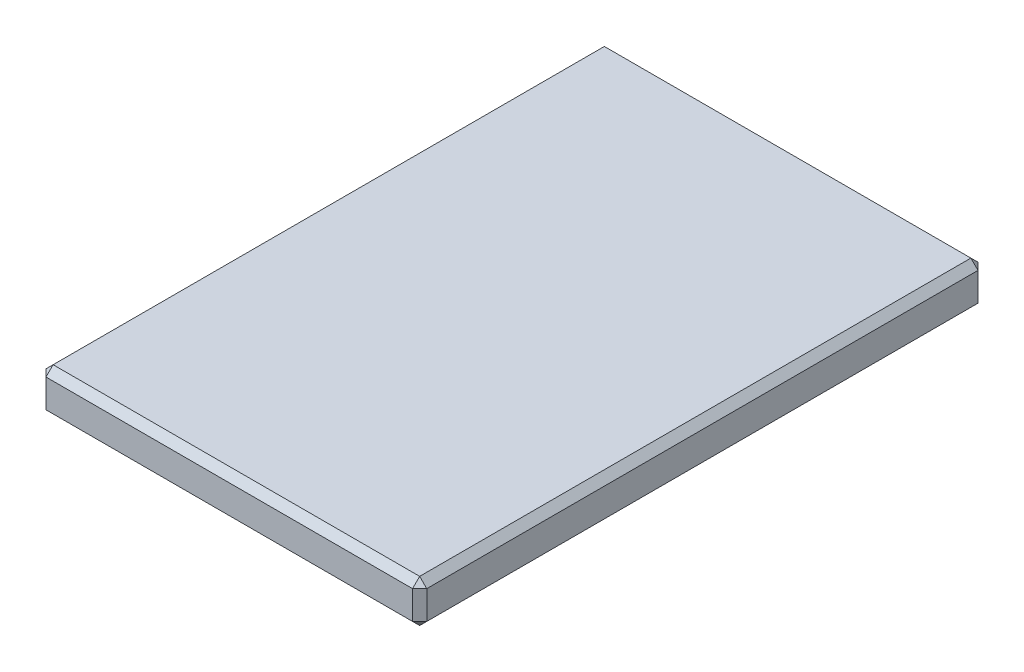
ISO-10303-21;
HEADER;
FILE_DESCRIPTION(('STEP AP214'),'2;1');
FILE_NAME('part.step','',(''),(''),'','','');
FILE_SCHEMA(('AUTOMOTIVE_DESIGN { 1 0 10303 214 1 1 1 1 }'));
ENDSEC;
DATA;
#1=APPLICATION_CONTEXT('core data for automotive mechanical design processes');
#2=APPLICATION_PROTOCOL_DEFINITION('international standard','automotive_design',2000,#1);
#3=PRODUCT_CONTEXT('',#1,'mechanical');
#4=PRODUCT('Part','Part','',(#3));
#5=PRODUCT_RELATED_PRODUCT_CATEGORY('part','',(#4));
#6=PRODUCT_DEFINITION_FORMATION('','',#4);
#7=PRODUCT_DEFINITION_CONTEXT('part definition',#1,'design');
#8=PRODUCT_DEFINITION('design','',#6,#7);
#9=PRODUCT_DEFINITION_SHAPE('','',#8);
#10=(LENGTH_UNIT() NAMED_UNIT(*) SI_UNIT(.MILLI.,.METRE.));
#11=(NAMED_UNIT(*) PLANE_ANGLE_UNIT() SI_UNIT($,.RADIAN.));
#12=(NAMED_UNIT(*) SI_UNIT($,.STERADIAN.) SOLID_ANGLE_UNIT());
#13=UNCERTAINTY_MEASURE_WITH_UNIT(LENGTH_MEASURE(1.E-05),#10,'distance_accuracy_value','');
#14=(GEOMETRIC_REPRESENTATION_CONTEXT(3) GLOBAL_UNCERTAINTY_ASSIGNED_CONTEXT((#13)) GLOBAL_UNIT_ASSIGNED_CONTEXT((#10,
#11,#12)) REPRESENTATION_CONTEXT('',''));
#15=CARTESIAN_POINT('',(0.,0.,0.));
#16=DIRECTION('',(0.,0.,1.));
#17=DIRECTION('',(1.,0.,0.));
#18=AXIS2_PLACEMENT_3D('',#15,#16,#17);
#19=CARTESIAN_POINT('',(0.,3.,0.));
#20=DIRECTION('',(1.,0.,0.));
#21=DIRECTION('',(0.,0.,-1.));
#22=AXIS2_PLACEMENT_3D('',#19,#20,#21);
#23=PLANE('',#22);
#24=DIRECTION('',(0.,-1.,0.));
#25=VECTOR('',#24,1.);
#26=CARTESIAN_POINT('',(0.,3.,0.500000000000007));
#27=LINE('',#26,#25);
#28=CARTESIAN_POINT('',(0.,2.49999999999999,0.500000000000007));
#29=VERTEX_POINT('',#28);
#30=CARTESIAN_POINT('',(0.,0.500000000000007,0.500000000000007));
#31=VERTEX_POINT('',#30);
#32=EDGE_CURVE('E132',#29,#31,#27,.T.);
#33=ORIENTED_EDGE('',*,*,#32,.T.);
#34=DIRECTION('',(0.,0.,1.));
#35=VECTOR('',#34,1.);
#36=CARTESIAN_POINT('',(0.,0.500000000000007,0.));
#37=LINE('',#36,#35);
#38=CARTESIAN_POINT('',(0.,0.500000000000007,39.3));
#39=VERTEX_POINT('',#38);
#40=EDGE_CURVE('E128',#31,#39,#37,.T.);
#41=ORIENTED_EDGE('',*,*,#40,.T.);
#42=DIRECTION('',(0.,1.,0.));
#43=VECTOR('',#42,1.);
#44=CARTESIAN_POINT('',(0.,3.,39.3));
#45=LINE('',#44,#43);
#46=CARTESIAN_POINT('',(0.,2.49999999999999,39.3));
#47=VERTEX_POINT('',#46);
#48=EDGE_CURVE('E121',#39,#47,#45,.T.);
#49=ORIENTED_EDGE('',*,*,#48,.T.);
#50=DIRECTION('',(0.,0.,-1.));
#51=VECTOR('',#50,1.);
#52=CARTESIAN_POINT('',(0.,2.49999999999999,0.));
#53=LINE('',#52,#51);
#54=EDGE_CURVE('E125',#47,#29,#53,.T.);
#55=ORIENTED_EDGE('',*,*,#54,.T.);
#56=EDGE_LOOP('',(#33,#41,#49,#55));
#57=FACE_BOUND('',#56,.T.);
#58=ADVANCED_FACE('F33',(#57),#23,.F.);
#59=CARTESIAN_POINT('',(0.,3.,39.8));
#60=DIRECTION('',(0.,0.,-1.));
#61=DIRECTION('',(-1.,0.,0.));
#62=AXIS2_PLACEMENT_3D('',#59,#60,#61);
#63=PLANE('',#62);
#64=DIRECTION('',(-1.,0.,0.));
#65=VECTOR('',#64,1.);
#66=CARTESIAN_POINT('',(0.,2.49999999999999,39.8));
#67=LINE('',#66,#65);
#68=CARTESIAN_POINT('',(26.3,2.49999999999999,39.8));
#69=VERTEX_POINT('',#68);
#70=CARTESIAN_POINT('',(0.500000000000012,2.49999999999999,39.8));
#71=VERTEX_POINT('',#70);
#72=EDGE_CURVE('E182',#69,#71,#67,.T.);
#73=ORIENTED_EDGE('',*,*,#72,.T.);
#74=DIRECTION('',(0.,-1.,0.));
#75=VECTOR('',#74,1.);
#76=CARTESIAN_POINT('',(0.500000000000012,3.,39.8));
#77=LINE('',#76,#75);
#78=CARTESIAN_POINT('',(0.500000000000012,0.500000000000007,39.8));
#79=VERTEX_POINT('',#78);
#80=EDGE_CURVE('E140',#71,#79,#77,.T.);
#81=ORIENTED_EDGE('',*,*,#80,.T.);
#82=DIRECTION('',(1.,0.,0.));
#83=VECTOR('',#82,1.);
#84=CARTESIAN_POINT('',(0.,0.500000000000007,39.8));
#85=LINE('',#84,#83);
#86=CARTESIAN_POINT('',(26.3,0.500000000000007,39.8));
#87=VERTEX_POINT('',#86);
#88=EDGE_CURVE('E186',#79,#87,#85,.T.);
#89=ORIENTED_EDGE('',*,*,#88,.T.);
#90=DIRECTION('',(0.,1.,0.));
#91=VECTOR('',#90,1.);
#92=CARTESIAN_POINT('',(26.3,3.,39.8));
#93=LINE('',#92,#91);
#94=EDGE_CURVE('E184',#87,#69,#93,.T.);
#95=ORIENTED_EDGE('',*,*,#94,.T.);
#96=EDGE_LOOP('',(#73,#81,#89,#95));
#97=FACE_BOUND('',#96,.T.);
#98=ADVANCED_FACE('F293',(#97),#63,.F.);
#99=CARTESIAN_POINT('',(26.8,3.,0.));
#100=DIRECTION('',(-1.,0.,0.));
#101=DIRECTION('',(0.,0.,1.));
#102=AXIS2_PLACEMENT_3D('',#99,#100,#101);
#103=PLANE('',#102);
#104=DIRECTION('',(0.,0.,-1.));
#105=VECTOR('',#104,1.);
#106=CARTESIAN_POINT('',(26.8,0.500000000000007,0.));
#107=LINE('',#106,#105);
#108=CARTESIAN_POINT('',(26.8,0.500000000000007,39.3));
#109=VERTEX_POINT('',#108);
#110=CARTESIAN_POINT('',(26.8,0.500000000000007,0.500000000000007));
#111=VERTEX_POINT('',#110);
#112=EDGE_CURVE('E177',#109,#111,#107,.T.);
#113=ORIENTED_EDGE('',*,*,#112,.T.);
#114=DIRECTION('',(0.,1.,0.));
#115=VECTOR('',#114,1.);
#116=CARTESIAN_POINT('',(26.8,3.,0.500000000000007));
#117=LINE('',#116,#115);
#118=CARTESIAN_POINT('',(26.8,2.49999999999999,0.500000000000007));
#119=VERTEX_POINT('',#118);
#120=EDGE_CURVE('E179',#111,#119,#117,.T.);
#121=ORIENTED_EDGE('',*,*,#120,.T.);
#122=DIRECTION('',(0.,0.,1.));
#123=VECTOR('',#122,1.);
#124=CARTESIAN_POINT('',(26.8,2.49999999999999,39.8));
#125=LINE('',#124,#123);
#126=CARTESIAN_POINT('',(26.8,2.49999999999999,39.3));
#127=VERTEX_POINT('',#126);
#128=EDGE_CURVE('E173',#119,#127,#125,.T.);
#129=ORIENTED_EDGE('',*,*,#128,.T.);
#130=DIRECTION('',(0.,-1.,0.));
#131=VECTOR('',#130,1.);
#132=CARTESIAN_POINT('',(26.8,3.,39.3));
#133=LINE('',#132,#131);
#134=EDGE_CURVE('E175',#127,#109,#133,.T.);
#135=ORIENTED_EDGE('',*,*,#134,.T.);
#136=EDGE_LOOP('',(#113,#121,#129,#135));
#137=FACE_BOUND('',#136,.T.);
#138=ADVANCED_FACE('F272',(#137),#103,.F.);
#139=CARTESIAN_POINT('',(0.,3.,0.));
#140=DIRECTION('',(0.,0.,1.));
#141=DIRECTION('',(1.,0.,0.));
#142=AXIS2_PLACEMENT_3D('',#139,#140,#141);
#143=PLANE('',#142);
#144=DIRECTION('',(0.,-1.,0.));
#145=VECTOR('',#144,1.);
#146=CARTESIAN_POINT('',(26.3,3.,0.));
#147=LINE('',#146,#145);
#148=CARTESIAN_POINT('',(26.3,2.49999999999999,0.));
#149=VERTEX_POINT('',#148);
#150=CARTESIAN_POINT('',(26.3,0.500000000000007,0.));
#151=VERTEX_POINT('',#150);
#152=EDGE_CURVE('E166',#149,#151,#147,.T.);
#153=ORIENTED_EDGE('',*,*,#152,.T.);
#154=DIRECTION('',(-1.,0.,0.));
#155=VECTOR('',#154,1.);
#156=CARTESIAN_POINT('',(0.,0.500000000000007,0.));
#157=LINE('',#156,#155);
#158=CARTESIAN_POINT('',(0.500000000000007,0.500000000000007,0.));
#159=VERTEX_POINT('',#158);
#160=EDGE_CURVE('E171',#151,#159,#157,.T.);
#161=ORIENTED_EDGE('',*,*,#160,.T.);
#162=DIRECTION('',(0.,1.,0.));
#163=VECTOR('',#162,1.);
#164=CARTESIAN_POINT('',(0.500000000000007,3.,0.));
#165=LINE('',#164,#163);
#166=CARTESIAN_POINT('',(0.500000000000007,2.49999999999999,0.));
#167=VERTEX_POINT('',#166);
#168=EDGE_CURVE('E168',#159,#167,#165,.T.);
#169=ORIENTED_EDGE('',*,*,#168,.T.);
#170=DIRECTION('',(1.,0.,0.));
#171=VECTOR('',#170,1.);
#172=CARTESIAN_POINT('',(26.8,2.49999999999999,0.));
#173=LINE('',#172,#171);
#174=EDGE_CURVE('E164',#167,#149,#173,.T.);
#175=ORIENTED_EDGE('',*,*,#174,.T.);
#176=EDGE_LOOP('',(#153,#161,#169,#175));
#177=FACE_BOUND('',#176,.T.);
#178=ADVANCED_FACE('F300',(#177),#143,.F.);
#179=CARTESIAN_POINT('',(0.,3.,0.));
#180=DIRECTION('',(0.,1.,0.));
#181=DIRECTION('',(0.,0.,1.));
#182=AXIS2_PLACEMENT_3D('',#179,#180,#181);
#183=PLANE('',#182);
#184=DIRECTION('',(0.,0.,-1.));
#185=VECTOR('',#184,1.);
#186=CARTESIAN_POINT('',(26.3,3.,0.));
#187=LINE('',#186,#185);
#188=CARTESIAN_POINT('',(26.3,3.,39.3));
#189=VERTEX_POINT('',#188);
#190=CARTESIAN_POINT('',(26.3,3.,0.500000000000007));
#191=VERTEX_POINT('',#190);
#192=EDGE_CURVE('E42',#189,#191,#187,.T.);
#193=ORIENTED_EDGE('',*,*,#192,.T.);
#194=DIRECTION('',(-1.,0.,0.));
#195=VECTOR('',#194,1.);
#196=CARTESIAN_POINT('',(0.,3.,0.500000000000007));
#197=LINE('',#196,#195);
#198=CARTESIAN_POINT('',(0.500000000000007,3.,0.500000000000007));
#199=VERTEX_POINT('',#198);
#200=EDGE_CURVE('E11',#191,#199,#197,.T.);
#201=ORIENTED_EDGE('',*,*,#200,.T.);
#202=DIRECTION('',(0.,0.,1.));
#203=VECTOR('',#202,1.);
#204=CARTESIAN_POINT('',(0.500000000000012,3.,39.8));
#205=LINE('',#204,#203);
#206=CARTESIAN_POINT('',(0.500000000000012,3.,39.3));
#207=VERTEX_POINT('',#206);
#208=EDGE_CURVE('E198',#199,#207,#205,.T.);
#209=ORIENTED_EDGE('',*,*,#208,.T.);
#210=DIRECTION('',(1.,0.,0.));
#211=VECTOR('',#210,1.);
#212=CARTESIAN_POINT('',(26.8,3.,39.3));
#213=LINE('',#212,#211);
#214=EDGE_CURVE('E53',#207,#189,#213,.T.);
#215=ORIENTED_EDGE('',*,*,#214,.T.);
#216=EDGE_LOOP('',(#193,#201,#209,#215));
#217=FACE_BOUND('',#216,.T.);
#218=ADVANCED_FACE('F364',(#217),#183,.T.);
#219=CARTESIAN_POINT('',(0.,0.,0.));
#220=DIRECTION('',(0.,1.,0.));
#221=DIRECTION('',(0.,0.,1.));
#222=AXIS2_PLACEMENT_3D('',#219,#220,#221);
#223=PLANE('',#222);
#224=DIRECTION('',(0.,0.,1.));
#225=VECTOR('',#224,1.);
#226=CARTESIAN_POINT('',(26.3,0.,0.));
#227=LINE('',#226,#225);
#228=CARTESIAN_POINT('',(26.3,0.,0.500000000000007));
#229=VERTEX_POINT('',#228);
#230=CARTESIAN_POINT('',(26.3,0.,39.3));
#231=VERTEX_POINT('',#230);
#232=EDGE_CURVE('E189',#229,#231,#227,.T.);
#233=ORIENTED_EDGE('',*,*,#232,.T.);
#234=DIRECTION('',(-1.,0.,0.));
#235=VECTOR('',#234,1.);
#236=CARTESIAN_POINT('',(0.,0.,39.3));
#237=LINE('',#236,#235);
#238=CARTESIAN_POINT('',(0.500000000000012,0.,39.3));
#239=VERTEX_POINT('',#238);
#240=EDGE_CURVE('E195',#231,#239,#237,.T.);
#241=ORIENTED_EDGE('',*,*,#240,.T.);
#242=DIRECTION('',(0.,0.,-1.));
#243=VECTOR('',#242,1.);
#244=CARTESIAN_POINT('',(0.500000000000007,0.,0.));
#245=LINE('',#244,#243);
#246=CARTESIAN_POINT('',(0.500000000000007,0.,0.500000000000007));
#247=VERTEX_POINT('',#246);
#248=EDGE_CURVE('E193',#239,#247,#245,.T.);
#249=ORIENTED_EDGE('',*,*,#248,.T.);
#250=DIRECTION('',(1.,0.,0.));
#251=VECTOR('',#250,1.);
#252=CARTESIAN_POINT('',(0.,0.,0.500000000000007));
#253=LINE('',#252,#251);
#254=EDGE_CURVE('E191',#247,#229,#253,.T.);
#255=ORIENTED_EDGE('',*,*,#254,.T.);
#256=EDGE_LOOP('',(#233,#241,#249,#255));
#257=FACE_BOUND('',#256,.T.);
#258=ADVANCED_FACE('F264',(#257),#223,.F.);
#259=CARTESIAN_POINT('',(26.8,3.,39.3));
#260=DIRECTION('',(-0.707106781186547,0.,-0.707106781186547));
#261=DIRECTION('',(0.,-1.,0.));
#262=AXIS2_PLACEMENT_3D('',#259,#260,#261);
#263=PLANE('',#262);
#264=DIRECTION('',(-0.707106781186548,0.,0.707106781186548));
#265=VECTOR('',#264,1.);
#266=CARTESIAN_POINT('',(26.3,2.49999999999999,39.8));
#267=LINE('',#266,#265);
#268=EDGE_CURVE('E37',#69,#127,#267,.F.);
#269=ORIENTED_EDGE('',*,*,#268,.F.);
#270=ORIENTED_EDGE('',*,*,#94,.F.);
#271=DIRECTION('',(0.707106781186548,0.,-0.707106781186548));
#272=VECTOR('',#271,1.);
#273=CARTESIAN_POINT('',(26.3,0.500000000000007,39.8));
#274=LINE('',#273,#272);
#275=EDGE_CURVE('E160',#109,#87,#274,.F.);
#276=ORIENTED_EDGE('',*,*,#275,.F.);
#277=ORIENTED_EDGE('',*,*,#134,.F.);
#278=EDGE_LOOP('',(#269,#270,#276,#277));
#279=FACE_BOUND('',#278,.T.);
#280=ADVANCED_FACE('F35',(#279),#263,.F.);
#281=CARTESIAN_POINT('',(26.3,2.49999999999999,39.8));
#282=DIRECTION('',(0.577350269189625,0.577350269189629,0.577350269189625));
#283=DIRECTION('',(0.,-0.707106781186545,0.70710678118655));
#284=AXIS2_PLACEMENT_3D('',#281,#282,#283);
#285=PLANE('',#284);
#286=DIRECTION('',(0.,-0.707106781186548,0.707106781186548));
#287=VECTOR('',#286,1.);
#288=CARTESIAN_POINT('',(26.3,2.49999999999999,39.8));
#289=LINE('',#288,#287);
#290=EDGE_CURVE('E244',#69,#189,#289,.F.);
#291=ORIENTED_EDGE('',*,*,#290,.F.);
#292=ORIENTED_EDGE('',*,*,#268,.T.);
#293=DIRECTION('',(-0.70710678118655,0.707106781186545,0.));
#294=VECTOR('',#293,1.);
#295=CARTESIAN_POINT('',(26.55,2.75,39.3));
#296=LINE('',#295,#294);
#297=EDGE_CURVE('E246',#189,#127,#296,.F.);
#298=ORIENTED_EDGE('',*,*,#297,.F.);
#299=EDGE_LOOP('',(#291,#292,#298));
#300=FACE_BOUND('',#299,.T.);
#301=ADVANCED_FACE('F288',(#300),#285,.T.);
#302=CARTESIAN_POINT('',(26.3,0.500000000000007,39.8));
#303=DIRECTION('',(0.577350269189625,-0.577350269189629,0.577350269189625));
#304=DIRECTION('',(0.,-0.707106781186545,-0.70710678118655));
#305=AXIS2_PLACEMENT_3D('',#302,#303,#304);
#306=PLANE('',#305);
#307=DIRECTION('',(-0.70710678118655,-0.707106781186545,0.));
#308=VECTOR('',#307,1.);
#309=CARTESIAN_POINT('',(26.55,0.250000000000004,39.3));
#310=LINE('',#309,#308);
#311=EDGE_CURVE('E238',#109,#231,#310,.T.);
#312=ORIENTED_EDGE('',*,*,#311,.F.);
#313=ORIENTED_EDGE('',*,*,#275,.T.);
#314=DIRECTION('',(0.,0.707106781186548,0.707106781186548));
#315=VECTOR('',#314,1.);
#316=CARTESIAN_POINT('',(26.3,0.500000000000007,39.8));
#317=LINE('',#316,#315);
#318=EDGE_CURVE('E241',#231,#87,#317,.T.);
#319=ORIENTED_EDGE('',*,*,#318,.F.);
#320=EDGE_LOOP('',(#312,#313,#319));
#321=FACE_BOUND('',#320,.T.);
#322=ADVANCED_FACE('F253',(#321),#306,.T.);
#323=CARTESIAN_POINT('',(26.3,3.,0.));
#324=DIRECTION('',(0.707106781186545,0.70710678118655,0.));
#325=DIRECTION('',(0.,0.,1.));
#326=AXIS2_PLACEMENT_3D('',#323,#324,#325);
#327=PLANE('',#326);
#328=ORIENTED_EDGE('',*,*,#297,.T.);
#329=ORIENTED_EDGE('',*,*,#128,.F.);
#330=DIRECTION('',(0.70710678118655,-0.707106781186545,0.));
#331=VECTOR('',#330,1.);
#332=CARTESIAN_POINT('',(26.8,2.49999999999999,0.500000000000007));
#333=LINE('',#332,#331);
#334=EDGE_CURVE('E233',#191,#119,#333,.T.);
#335=ORIENTED_EDGE('',*,*,#334,.F.);
#336=ORIENTED_EDGE('',*,*,#192,.F.);
#337=EDGE_LOOP('',(#328,#329,#335,#336));
#338=FACE_BOUND('',#337,.T.);
#339=ADVANCED_FACE('F283',(#338),#327,.T.);
#340=CARTESIAN_POINT('',(0.,3.,39.3));
#341=DIRECTION('',(0.,0.707106781186547,0.707106781186547));
#342=DIRECTION('',(-1.,0.,0.));
#343=AXIS2_PLACEMENT_3D('',#340,#341,#342);
#344=PLANE('',#343);
#345=ORIENTED_EDGE('',*,*,#290,.T.);
#346=ORIENTED_EDGE('',*,*,#214,.F.);
#347=DIRECTION('',(0.,0.707106781186547,-0.707106781186547));
#348=VECTOR('',#347,1.);
#349=CARTESIAN_POINT('',(0.500000000000012,2.75,39.55));
#350=LINE('',#349,#348);
#351=EDGE_CURVE('E144',#71,#207,#350,.T.);
#352=ORIENTED_EDGE('',*,*,#351,.F.);
#353=ORIENTED_EDGE('',*,*,#72,.F.);
#354=EDGE_LOOP('',(#345,#346,#352,#353));
#355=FACE_BOUND('',#354,.T.);
#356=ADVANCED_FACE('F291',(#355),#344,.T.);
#357=CARTESIAN_POINT('',(0.500000000000012,3.,39.8));
#358=DIRECTION('',(0.707106781186547,0.,-0.707106781186547));
#359=DIRECTION('',(0.,-1.,0.));
#360=AXIS2_PLACEMENT_3D('',#357,#358,#359);
#361=PLANE('',#360);
#362=DIRECTION('',(0.707106781186547,0.,0.707106781186547));
#363=VECTOR('',#362,1.);
#364=CARTESIAN_POINT('',(0.500000000000012,0.500000000000007,39.8));
#365=LINE('',#364,#363);
#366=EDGE_CURVE('E145',#79,#39,#365,.F.);
#367=ORIENTED_EDGE('',*,*,#366,.F.);
#368=ORIENTED_EDGE('',*,*,#80,.F.);
#369=DIRECTION('',(-0.707106781186547,0.,-0.707106781186547));
#370=VECTOR('',#369,1.);
#371=CARTESIAN_POINT('',(0.,2.49999999999999,39.3));
#372=LINE('',#371,#370);
#373=EDGE_CURVE('E136',#47,#71,#372,.F.);
#374=ORIENTED_EDGE('',*,*,#373,.F.);
#375=ORIENTED_EDGE('',*,*,#48,.F.);
#376=EDGE_LOOP('',(#367,#368,#374,#375));
#377=FACE_BOUND('',#376,.T.);
#378=ADVANCED_FACE('F138',(#377),#361,.F.);
#379=CARTESIAN_POINT('',(0.,0.500000000000007,39.8));
#380=DIRECTION('',(0.,0.707106781186547,-0.707106781186547));
#381=DIRECTION('',(1.,0.,0.));
#382=AXIS2_PLACEMENT_3D('',#379,#380,#381);
#383=PLANE('',#382);
#384=ORIENTED_EDGE('',*,*,#318,.T.);
#385=ORIENTED_EDGE('',*,*,#88,.F.);
#386=DIRECTION('',(0.,-0.707106781186547,-0.707106781186547));
#387=VECTOR('',#386,1.);
#388=CARTESIAN_POINT('',(0.500000000000012,0.500000000000007,39.8));
#389=LINE('',#388,#387);
#390=EDGE_CURVE('E229',#239,#79,#389,.F.);
#391=ORIENTED_EDGE('',*,*,#390,.F.);
#392=ORIENTED_EDGE('',*,*,#240,.F.);
#393=EDGE_LOOP('',(#384,#385,#391,#392));
#394=FACE_BOUND('',#393,.T.);
#395=ADVANCED_FACE('F261',(#394),#383,.F.);
#396=CARTESIAN_POINT('',(26.8,0.500000000000007,0.));
#397=DIRECTION('',(-0.707106781186545,0.70710678118655,0.));
#398=DIRECTION('',(0.,0.,-1.));
#399=AXIS2_PLACEMENT_3D('',#396,#397,#398);
#400=PLANE('',#399);
#401=ORIENTED_EDGE('',*,*,#311,.T.);
#402=ORIENTED_EDGE('',*,*,#232,.F.);
#403=DIRECTION('',(0.70710678118655,0.707106781186545,0.));
#404=VECTOR('',#403,1.);
#405=CARTESIAN_POINT('',(26.55,0.250000000000004,0.500000000000007));
#406=LINE('',#405,#404);
#407=EDGE_CURVE('E226',#111,#229,#406,.F.);
#408=ORIENTED_EDGE('',*,*,#407,.F.);
#409=ORIENTED_EDGE('',*,*,#112,.F.);
#410=EDGE_LOOP('',(#401,#402,#408,#409));
#411=FACE_BOUND('',#410,.T.);
#412=ADVANCED_FACE('F269',(#411),#400,.F.);
#413=CARTESIAN_POINT('',(26.3,3.,0.));
#414=DIRECTION('',(-0.707106781186547,0.,0.707106781186547));
#415=DIRECTION('',(0.,-1.,0.));
#416=AXIS2_PLACEMENT_3D('',#413,#414,#415);
#417=PLANE('',#416);
#418=DIRECTION('',(0.707106781186547,0.,0.707106781186547));
#419=VECTOR('',#418,1.);
#420=CARTESIAN_POINT('',(26.8,2.49999999999999,0.500000000000007));
#421=LINE('',#420,#419);
#422=EDGE_CURVE('E235',#119,#149,#421,.F.);
#423=ORIENTED_EDGE('',*,*,#422,.F.);
#424=ORIENTED_EDGE('',*,*,#120,.F.);
#425=DIRECTION('',(-0.707106781186547,0.,-0.707106781186547));
#426=VECTOR('',#425,1.);
#427=CARTESIAN_POINT('',(26.3,0.500000000000007,0.));
#428=LINE('',#427,#426);
#429=EDGE_CURVE('E223',#151,#111,#428,.F.);
#430=ORIENTED_EDGE('',*,*,#429,.F.);
#431=ORIENTED_EDGE('',*,*,#152,.F.);
#432=EDGE_LOOP('',(#423,#424,#430,#431));
#433=FACE_BOUND('',#432,.T.);
#434=ADVANCED_FACE('F276',(#433),#417,.F.);
#435=CARTESIAN_POINT('',(26.8,2.49999999999999,0.500000000000007));
#436=DIRECTION('',(0.577350269189625,0.577350269189628,-0.577350269189625));
#437=DIRECTION('',(-0.70710678118655,0.707106781186545,0.));
#438=AXIS2_PLACEMENT_3D('',#435,#436,#437);
#439=PLANE('',#438);
#440=ORIENTED_EDGE('',*,*,#334,.T.);
#441=ORIENTED_EDGE('',*,*,#422,.T.);
#442=DIRECTION('',(0.,0.707106781186547,0.707106781186547));
#443=VECTOR('',#442,1.);
#444=CARTESIAN_POINT('',(26.3,2.74999999999999,0.250000000000002));
#445=LINE('',#444,#443);
#446=EDGE_CURVE('E152',#191,#149,#445,.F.);
#447=ORIENTED_EDGE('',*,*,#446,.F.);
#448=EDGE_LOOP('',(#440,#441,#447));
#449=FACE_BOUND('',#448,.T.);
#450=ADVANCED_FACE('F341',(#449),#439,.T.);
#451=CARTESIAN_POINT('',(0.,2.49999999999999,39.3));
#452=DIRECTION('',(-0.577350269189626,0.577350269189626,0.577350269189626));
#453=DIRECTION('',(0.707106781186547,0.,0.707106781186547));
#454=AXIS2_PLACEMENT_3D('',#451,#452,#453);
#455=PLANE('',#454);
#456=ORIENTED_EDGE('',*,*,#373,.T.);
#457=ORIENTED_EDGE('',*,*,#351,.T.);
#458=DIRECTION('',(-0.707106781186547,-0.707106781186547,0.));
#459=VECTOR('',#458,1.);
#460=CARTESIAN_POINT('',(0.,2.49999999999999,39.3));
#461=LINE('',#460,#459);
#462=EDGE_CURVE('E148',#47,#207,#461,.F.);
#463=ORIENTED_EDGE('',*,*,#462,.F.);
#464=EDGE_LOOP('',(#456,#457,#463));
#465=FACE_BOUND('',#464,.T.);
#466=ADVANCED_FACE('F149',(#465),#455,.T.);
#467=CARTESIAN_POINT('',(0.500000000000012,0.500000000000007,39.8));
#468=DIRECTION('',(-0.577350269189626,-0.577350269189626,0.577350269189626));
#469=DIRECTION('',(0.707106781186547,0.,0.707106781186547));
#470=AXIS2_PLACEMENT_3D('',#467,#468,#469);
#471=PLANE('',#470);
#472=ORIENTED_EDGE('',*,*,#390,.T.);
#473=ORIENTED_EDGE('',*,*,#366,.T.);
#474=DIRECTION('',(-0.707106781186547,0.707106781186547,0.));
#475=VECTOR('',#474,1.);
#476=CARTESIAN_POINT('',(0.250000000000008,0.250000000000004,39.3));
#477=LINE('',#476,#475);
#478=EDGE_CURVE('E153',#239,#39,#477,.T.);
#479=ORIENTED_EDGE('',*,*,#478,.F.);
#480=EDGE_LOOP('',(#472,#473,#479));
#481=FACE_BOUND('',#480,.T.);
#482=ADVANCED_FACE('F334',(#481),#471,.T.);
#483=CARTESIAN_POINT('',(26.3,0.500000000000007,0.));
#484=DIRECTION('',(0.577350269189625,-0.577350269189628,-0.577350269189624));
#485=DIRECTION('',(0.70710678118655,0.707106781186545,0.));
#486=AXIS2_PLACEMENT_3D('',#483,#484,#485);
#487=PLANE('',#486);
#488=ORIENTED_EDGE('',*,*,#429,.T.);
#489=ORIENTED_EDGE('',*,*,#407,.T.);
#490=DIRECTION('',(0.,-0.707106781186548,0.707106781186548));
#491=VECTOR('',#490,1.);
#492=CARTESIAN_POINT('',(26.3,0.500000000000007,0.));
#493=LINE('',#492,#491);
#494=EDGE_CURVE('E216',#151,#229,#493,.T.);
#495=ORIENTED_EDGE('',*,*,#494,.F.);
#496=EDGE_LOOP('',(#488,#489,#495));
#497=FACE_BOUND('',#496,.T.);
#498=ADVANCED_FACE('F330',(#497),#487,.T.);
#499=CARTESIAN_POINT('',(0.,3.,0.500000000000007));
#500=DIRECTION('',(0.,0.707106781186547,-0.707106781186547));
#501=DIRECTION('',(1.,0.,0.));
#502=AXIS2_PLACEMENT_3D('',#499,#500,#501);
#503=PLANE('',#502);
#504=ORIENTED_EDGE('',*,*,#446,.T.);
#505=ORIENTED_EDGE('',*,*,#174,.F.);
#506=DIRECTION('',(0.,-0.707106781186548,-0.707106781186548));
#507=VECTOR('',#506,1.);
#508=CARTESIAN_POINT('',(0.500000000000007,2.49999999999999,0.));
#509=LINE('',#508,#507);
#510=EDGE_CURVE('E213',#199,#167,#509,.T.);
#511=ORIENTED_EDGE('',*,*,#510,.F.);
#512=ORIENTED_EDGE('',*,*,#200,.F.);
#513=EDGE_LOOP('',(#504,#505,#511,#512));
#514=FACE_BOUND('',#513,.T.);
#515=ADVANCED_FACE('F327',(#514),#503,.T.);
#516=CARTESIAN_POINT('',(0.500000000000007,3.,0.));
#517=DIRECTION('',(-0.707106781186547,0.707106781186547,0.));
#518=DIRECTION('',(0.,0.,-1.));
#519=AXIS2_PLACEMENT_3D('',#516,#517,#518);
#520=PLANE('',#519);
#521=ORIENTED_EDGE('',*,*,#462,.T.);
#522=ORIENTED_EDGE('',*,*,#208,.F.);
#523=DIRECTION('',(0.707106781186548,0.707106781186548,0.));
#524=VECTOR('',#523,1.);
#525=CARTESIAN_POINT('',(0.250000000000004,2.75,0.500000000000007));
#526=LINE('',#525,#524);
#527=EDGE_CURVE('E156',#29,#199,#526,.T.);
#528=ORIENTED_EDGE('',*,*,#527,.F.);
#529=ORIENTED_EDGE('',*,*,#54,.F.);
#530=EDGE_LOOP('',(#521,#522,#528,#529));
#531=FACE_BOUND('',#530,.T.);
#532=ADVANCED_FACE('F155',(#531),#520,.T.);
#533=CARTESIAN_POINT('',(0.,0.500000000000007,0.));
#534=DIRECTION('',(0.707106781186547,0.707106781186547,0.));
#535=DIRECTION('',(0.,0.,1.));
#536=AXIS2_PLACEMENT_3D('',#533,#534,#535);
#537=PLANE('',#536);
#538=ORIENTED_EDGE('',*,*,#478,.T.);
#539=ORIENTED_EDGE('',*,*,#40,.F.);
#540=DIRECTION('',(0.707106781186548,-0.707106781186548,0.));
#541=VECTOR('',#540,1.);
#542=CARTESIAN_POINT('',(0.,0.500000000000007,0.500000000000007));
#543=LINE('',#542,#541);
#544=EDGE_CURVE('E209',#247,#31,#543,.F.);
#545=ORIENTED_EDGE('',*,*,#544,.F.);
#546=ORIENTED_EDGE('',*,*,#248,.F.);
#547=EDGE_LOOP('',(#538,#539,#545,#546));
#548=FACE_BOUND('',#547,.T.);
#549=ADVANCED_FACE('F320',(#548),#537,.F.);
#550=CARTESIAN_POINT('',(0.,0.500000000000007,0.));
#551=DIRECTION('',(0.,0.707106781186547,0.707106781186547));
#552=DIRECTION('',(-1.,0.,0.));
#553=AXIS2_PLACEMENT_3D('',#550,#551,#552);
#554=PLANE('',#553);
#555=ORIENTED_EDGE('',*,*,#494,.T.);
#556=ORIENTED_EDGE('',*,*,#254,.F.);
#557=DIRECTION('',(0.,0.707106781186548,-0.707106781186548));
#558=VECTOR('',#557,1.);
#559=CARTESIAN_POINT('',(0.500000000000007,0.250000000000004,0.250000000000004));
#560=LINE('',#559,#558);
#561=EDGE_CURVE('E206',#159,#247,#560,.F.);
#562=ORIENTED_EDGE('',*,*,#561,.F.);
#563=ORIENTED_EDGE('',*,*,#160,.F.);
#564=EDGE_LOOP('',(#555,#556,#562,#563));
#565=FACE_BOUND('',#564,.T.);
#566=ADVANCED_FACE('F316',(#565),#554,.F.);
#567=CARTESIAN_POINT('',(0.500000000000007,2.49999999999999,0.));
#568=DIRECTION('',(-0.577350269189626,0.577350269189626,-0.577350269189626));
#569=DIRECTION('',(-0.707106781186547,0.,0.707106781186548));
#570=AXIS2_PLACEMENT_3D('',#567,#568,#569);
#571=PLANE('',#570);
#572=ORIENTED_EDGE('',*,*,#527,.T.);
#573=ORIENTED_EDGE('',*,*,#510,.T.);
#574=DIRECTION('',(0.707106781186547,0.,-0.707106781186548));
#575=VECTOR('',#574,1.);
#576=CARTESIAN_POINT('',(0.500000000000007,2.49999999999999,0.));
#577=LINE('',#576,#575);
#578=EDGE_CURVE('E204',#29,#167,#577,.T.);
#579=ORIENTED_EDGE('',*,*,#578,.F.);
#580=EDGE_LOOP('',(#572,#573,#579));
#581=FACE_BOUND('',#580,.T.);
#582=ADVANCED_FACE('F312',(#581),#571,.T.);
#583=CARTESIAN_POINT('',(0.,0.500000000000007,0.500000000000007));
#584=DIRECTION('',(-0.577350269189626,-0.577350269189626,-0.577350269189626));
#585=DIRECTION('',(-0.707106781186547,0.,0.707106781186548));
#586=AXIS2_PLACEMENT_3D('',#583,#584,#585);
#587=PLANE('',#586);
#588=ORIENTED_EDGE('',*,*,#561,.T.);
#589=ORIENTED_EDGE('',*,*,#544,.T.);
#590=DIRECTION('',(-0.707106781186547,0.,0.707106781186548));
#591=VECTOR('',#590,1.);
#592=CARTESIAN_POINT('',(0.,0.500000000000007,0.500000000000007));
#593=LINE('',#592,#591);
#594=EDGE_CURVE('E202',#159,#31,#593,.T.);
#595=ORIENTED_EDGE('',*,*,#594,.F.);
#596=EDGE_LOOP('',(#588,#589,#595));
#597=FACE_BOUND('',#596,.T.);
#598=ADVANCED_FACE('F308',(#597),#587,.T.);
#599=CARTESIAN_POINT('',(0.,3.,0.500000000000007));
#600=DIRECTION('',(0.707106781186548,0.,0.707106781186547));
#601=DIRECTION('',(0.,-1.,0.));
#602=AXIS2_PLACEMENT_3D('',#599,#600,#601);
#603=PLANE('',#602);
#604=ORIENTED_EDGE('',*,*,#578,.T.);
#605=ORIENTED_EDGE('',*,*,#168,.F.);
#606=ORIENTED_EDGE('',*,*,#594,.T.);
#607=ORIENTED_EDGE('',*,*,#32,.F.);
#608=EDGE_LOOP('',(#604,#605,#606,#607));
#609=FACE_BOUND('',#608,.T.);
#610=ADVANCED_FACE('F305',(#609),#603,.F.);
#611=CLOSED_SHELL('',(#58,#98,#138,#178,#218,#258,#280,#301,#322,#339,#356,#378,#395,#412,#434,
#450,#466,#482,#498,#515,#532,#549,#566,#582,#598,#610));
#612=MANIFOLD_SOLID_BREP('B2',#611);
#613=ADVANCED_BREP_SHAPE_REPRESENTATION('',(#18,#612),#14);
#614=SHAPE_DEFINITION_REPRESENTATION(#9,#613);
ENDSEC;
END-ISO-10303-21;
